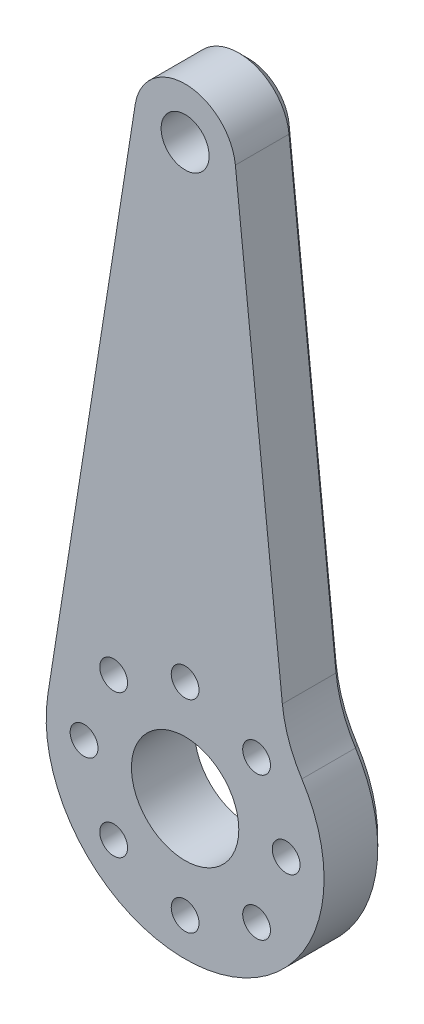
ISO-10303-21;
HEADER;
FILE_DESCRIPTION(('STEP AP214'),'2;1');
FILE_NAME('part.step','',(''),(''),'','','');
FILE_SCHEMA(('AUTOMOTIVE_DESIGN { 1 0 10303 214 1 1 1 1 }'));
ENDSEC;
DATA;
#1=APPLICATION_CONTEXT('core data for automotive mechanical design processes');
#2=APPLICATION_PROTOCOL_DEFINITION('international standard','automotive_design',2000,#1);
#3=PRODUCT_CONTEXT('',#1,'mechanical');
#4=PRODUCT('Part','Part','',(#3));
#5=PRODUCT_RELATED_PRODUCT_CATEGORY('part','',(#4));
#6=PRODUCT_DEFINITION_FORMATION('','',#4);
#7=PRODUCT_DEFINITION_CONTEXT('part definition',#1,'design');
#8=PRODUCT_DEFINITION('design','',#6,#7);
#9=PRODUCT_DEFINITION_SHAPE('','',#8);
#10=(LENGTH_UNIT() NAMED_UNIT(*) SI_UNIT(.MILLI.,.METRE.));
#11=(NAMED_UNIT(*) PLANE_ANGLE_UNIT() SI_UNIT($,.RADIAN.));
#12=(NAMED_UNIT(*) SI_UNIT($,.STERADIAN.) SOLID_ANGLE_UNIT());
#13=UNCERTAINTY_MEASURE_WITH_UNIT(LENGTH_MEASURE(1.E-05),#10,'distance_accuracy_value','');
#14=(GEOMETRIC_REPRESENTATION_CONTEXT(3) GLOBAL_UNCERTAINTY_ASSIGNED_CONTEXT((#13)) GLOBAL_UNIT_ASSIGNED_CONTEXT((#10,
#11,#12)) REPRESENTATION_CONTEXT('',''));
#15=CARTESIAN_POINT('',(0.,0.,0.));
#16=DIRECTION('',(0.,0.,1.));
#17=DIRECTION('',(1.,0.,0.));
#18=AXIS2_PLACEMENT_3D('',#15,#16,#17);
#19=CARTESIAN_POINT('',(-7.02420987567219,-20.1350147129871,5.));
#20=DIRECTION('',(0.,0.,-1.));
#21=DIRECTION('',(-1.,0.,0.));
#22=AXIS2_PLACEMENT_3D('',#19,#20,#21);
#23=CYLINDRICAL_SURFACE('',#22,1.1);
#24=CARTESIAN_POINT('',(-7.02420987567219,-20.1350147129871,5.));
#25=DIRECTION('',(0.,0.,1.));
#26=DIRECTION('',(1.,0.,0.));
#27=AXIS2_PLACEMENT_3D('',#24,#25,#26);
#28=CIRCLE('',#27,1.1);
#29=CARTESIAN_POINT('',(-5.92420987567219,-20.1350147129871,5.));
#30=VERTEX_POINT('',#29);
#31=EDGE_CURVE('E203',#30,#30,#28,.T.);
#32=ORIENTED_EDGE('',*,*,#31,.T.);
#33=EDGE_LOOP('',(#32));
#34=FACE_BOUND('',#33,.T.);
#35=CARTESIAN_POINT('',(-7.02420987567219,-20.1350147129871,2.25));
#36=DIRECTION('',(0.,0.,-1.));
#37=DIRECTION('',(-1.,0.,0.));
#38=AXIS2_PLACEMENT_3D('',#35,#36,#37);
#39=CIRCLE('',#38,1.1);
#40=CARTESIAN_POINT('',(-8.12420987567219,-20.1350147129871,2.25));
#41=VERTEX_POINT('',#40);
#42=EDGE_CURVE('E185',#41,#41,#39,.T.);
#43=ORIENTED_EDGE('',*,*,#42,.T.);
#44=EDGE_LOOP('',(#43));
#45=FACE_BOUND('',#44,.T.);
#46=ADVANCED_FACE('F39',(#34,#45),#23,.F.);
#47=CARTESIAN_POINT('',(-9.36735562617982,-25.7918689624794,5.));
#48=DIRECTION('',(0.,0.,-1.));
#49=DIRECTION('',(-1.,0.,0.));
#50=AXIS2_PLACEMENT_3D('',#47,#48,#49);
#51=CYLINDRICAL_SURFACE('',#50,1.1);
#52=CARTESIAN_POINT('',(-9.36735562617982,-25.7918689624794,5.));
#53=DIRECTION('',(0.,0.,1.));
#54=DIRECTION('',(1.,0.,0.));
#55=AXIS2_PLACEMENT_3D('',#52,#53,#54);
#56=CIRCLE('',#55,1.1);
#57=CARTESIAN_POINT('',(-8.26735562617982,-25.7918689624794,5.));
#58=VERTEX_POINT('',#57);
#59=EDGE_CURVE('E200',#58,#58,#56,.T.);
#60=ORIENTED_EDGE('',*,*,#59,.T.);
#61=EDGE_LOOP('',(#60));
#62=FACE_BOUND('',#61,.T.);
#63=CARTESIAN_POINT('',(-9.36735562617982,-25.7918689624794,2.25));
#64=DIRECTION('',(0.,0.,-1.));
#65=DIRECTION('',(-1.,0.,0.));
#66=AXIS2_PLACEMENT_3D('',#63,#64,#65);
#67=CIRCLE('',#66,1.1);
#68=CARTESIAN_POINT('',(-10.4673556261798,-25.7918689624794,2.25));
#69=VERTEX_POINT('',#68);
#70=EDGE_CURVE('E241',#69,#69,#67,.T.);
#71=ORIENTED_EDGE('',*,*,#70,.T.);
#72=EDGE_LOOP('',(#71));
#73=FACE_BOUND('',#72,.T.);
#74=ADVANCED_FACE('F345',(#62,#73),#51,.F.);
#75=CARTESIAN_POINT('',(-15.0242098756722,-28.1350147129871,5.));
#76=DIRECTION('',(0.,0.,-1.));
#77=DIRECTION('',(-1.,0.,0.));
#78=AXIS2_PLACEMENT_3D('',#75,#76,#77);
#79=CYLINDRICAL_SURFACE('',#78,1.1);
#80=CARTESIAN_POINT('',(-15.0242098756722,-28.1350147129871,5.));
#81=DIRECTION('',(0.,0.,1.));
#82=DIRECTION('',(1.,0.,0.));
#83=AXIS2_PLACEMENT_3D('',#80,#81,#82);
#84=CIRCLE('',#83,1.1);
#85=CARTESIAN_POINT('',(-13.9242098756722,-28.1350147129871,5.));
#86=VERTEX_POINT('',#85);
#87=EDGE_CURVE('E197',#86,#86,#84,.T.);
#88=ORIENTED_EDGE('',*,*,#87,.T.);
#89=EDGE_LOOP('',(#88));
#90=FACE_BOUND('',#89,.T.);
#91=CARTESIAN_POINT('',(-15.0242098756722,-28.1350147129871,2.25));
#92=DIRECTION('',(0.,0.,-1.));
#93=DIRECTION('',(-1.,0.,0.));
#94=AXIS2_PLACEMENT_3D('',#91,#92,#93);
#95=CIRCLE('',#94,1.1);
#96=CARTESIAN_POINT('',(-16.1242098756722,-28.1350147129871,2.25));
#97=VERTEX_POINT('',#96);
#98=EDGE_CURVE('E238',#97,#97,#95,.T.);
#99=ORIENTED_EDGE('',*,*,#98,.T.);
#100=EDGE_LOOP('',(#99));
#101=FACE_BOUND('',#100,.T.);
#102=ADVANCED_FACE('F350',(#90,#101),#79,.F.);
#103=CARTESIAN_POINT('',(-20.6810641251646,-25.7918689624794,5.));
#104=DIRECTION('',(0.,0.,-1.));
#105=DIRECTION('',(-1.,0.,0.));
#106=AXIS2_PLACEMENT_3D('',#103,#104,#105);
#107=CYLINDRICAL_SURFACE('',#106,1.1);
#108=CARTESIAN_POINT('',(-20.6810641251646,-25.7918689624794,5.));
#109=DIRECTION('',(0.,0.,1.));
#110=DIRECTION('',(1.,0.,0.));
#111=AXIS2_PLACEMENT_3D('',#108,#109,#110);
#112=CIRCLE('',#111,1.1);
#113=CARTESIAN_POINT('',(-19.5810641251646,-25.7918689624794,5.));
#114=VERTEX_POINT('',#113);
#115=EDGE_CURVE('E194',#114,#114,#112,.T.);
#116=ORIENTED_EDGE('',*,*,#115,.T.);
#117=EDGE_LOOP('',(#116));
#118=FACE_BOUND('',#117,.T.);
#119=CARTESIAN_POINT('',(-20.6810641251646,-25.7918689624794,2.25));
#120=DIRECTION('',(0.,0.,-1.));
#121=DIRECTION('',(-1.,0.,0.));
#122=AXIS2_PLACEMENT_3D('',#119,#120,#121);
#123=CIRCLE('',#122,1.1);
#124=CARTESIAN_POINT('',(-21.7810641251646,-25.7918689624794,2.25));
#125=VERTEX_POINT('',#124);
#126=EDGE_CURVE('E235',#125,#125,#123,.T.);
#127=ORIENTED_EDGE('',*,*,#126,.T.);
#128=EDGE_LOOP('',(#127));
#129=FACE_BOUND('',#128,.T.);
#130=ADVANCED_FACE('F357',(#118,#129),#107,.F.);
#131=CARTESIAN_POINT('',(-23.0242098756722,-20.1350147129871,5.));
#132=DIRECTION('',(0.,0.,-1.));
#133=DIRECTION('',(-1.,0.,0.));
#134=AXIS2_PLACEMENT_3D('',#131,#132,#133);
#135=CYLINDRICAL_SURFACE('',#134,1.1);
#136=CARTESIAN_POINT('',(-23.0242098756722,-20.1350147129871,5.));
#137=DIRECTION('',(0.,0.,1.));
#138=DIRECTION('',(1.,0.,0.));
#139=AXIS2_PLACEMENT_3D('',#136,#137,#138);
#140=CIRCLE('',#139,1.1);
#141=CARTESIAN_POINT('',(-21.9242098756722,-20.1350147129871,5.));
#142=VERTEX_POINT('',#141);
#143=EDGE_CURVE('E191',#142,#142,#140,.T.);
#144=ORIENTED_EDGE('',*,*,#143,.T.);
#145=EDGE_LOOP('',(#144));
#146=FACE_BOUND('',#145,.T.);
#147=CARTESIAN_POINT('',(-23.0242098756722,-20.1350147129871,2.25));
#148=DIRECTION('',(0.,0.,-1.));
#149=DIRECTION('',(-1.,0.,0.));
#150=AXIS2_PLACEMENT_3D('',#147,#148,#149);
#151=CIRCLE('',#150,1.1);
#152=CARTESIAN_POINT('',(-24.1242098756722,-20.1350147129871,2.25));
#153=VERTEX_POINT('',#152);
#154=EDGE_CURVE('E232',#153,#153,#151,.T.);
#155=ORIENTED_EDGE('',*,*,#154,.T.);
#156=EDGE_LOOP('',(#155));
#157=FACE_BOUND('',#156,.T.);
#158=ADVANCED_FACE('F361',(#146,#157),#135,.F.);
#159=CARTESIAN_POINT('',(-20.6810641251646,-14.4781604634947,5.));
#160=DIRECTION('',(0.,0.,-1.));
#161=DIRECTION('',(-1.,0.,0.));
#162=AXIS2_PLACEMENT_3D('',#159,#160,#161);
#163=CYLINDRICAL_SURFACE('',#162,1.1);
#164=CARTESIAN_POINT('',(-20.6810641251646,-14.4781604634947,5.));
#165=DIRECTION('',(0.,0.,1.));
#166=DIRECTION('',(1.,0.,0.));
#167=AXIS2_PLACEMENT_3D('',#164,#165,#166);
#168=CIRCLE('',#167,1.1);
#169=CARTESIAN_POINT('',(-19.5810641251646,-14.4781604634947,5.));
#170=VERTEX_POINT('',#169);
#171=EDGE_CURVE('E188',#170,#170,#168,.T.);
#172=ORIENTED_EDGE('',*,*,#171,.T.);
#173=EDGE_LOOP('',(#172));
#174=FACE_BOUND('',#173,.T.);
#175=CARTESIAN_POINT('',(-20.6810641251646,-14.4781604634947,2.25));
#176=DIRECTION('',(0.,0.,-1.));
#177=DIRECTION('',(-1.,0.,0.));
#178=AXIS2_PLACEMENT_3D('',#175,#176,#177);
#179=CIRCLE('',#178,1.1);
#180=CARTESIAN_POINT('',(-21.7810641251646,-14.4781604634947,2.25));
#181=VERTEX_POINT('',#180);
#182=EDGE_CURVE('E229',#181,#181,#179,.T.);
#183=ORIENTED_EDGE('',*,*,#182,.T.);
#184=EDGE_LOOP('',(#183));
#185=FACE_BOUND('',#184,.T.);
#186=ADVANCED_FACE('F365',(#174,#185),#163,.F.);
#187=CARTESIAN_POINT('',(-15.0242098756722,-12.1350147129871,5.));
#188=DIRECTION('',(0.,0.,-1.));
#189=DIRECTION('',(-1.,0.,0.));
#190=AXIS2_PLACEMENT_3D('',#187,#188,#189);
#191=CYLINDRICAL_SURFACE('',#190,1.1);
#192=CARTESIAN_POINT('',(-15.0242098756722,-12.1350147129871,5.));
#193=DIRECTION('',(0.,0.,1.));
#194=DIRECTION('',(1.,0.,0.));
#195=AXIS2_PLACEMENT_3D('',#192,#193,#194);
#196=CIRCLE('',#195,1.1);
#197=CARTESIAN_POINT('',(-13.9242098756722,-12.1350147129871,5.));
#198=VERTEX_POINT('',#197);
#199=EDGE_CURVE('E184',#198,#198,#196,.T.);
#200=ORIENTED_EDGE('',*,*,#199,.T.);
#201=EDGE_LOOP('',(#200));
#202=FACE_BOUND('',#201,.T.);
#203=CARTESIAN_POINT('',(-15.0242098756722,-12.1350147129871,2.25));
#204=DIRECTION('',(0.,0.,-1.));
#205=DIRECTION('',(-1.,0.,0.));
#206=AXIS2_PLACEMENT_3D('',#203,#204,#205);
#207=CIRCLE('',#206,1.1);
#208=CARTESIAN_POINT('',(-16.1242098756722,-12.1350147129871,2.25));
#209=VERTEX_POINT('',#208);
#210=EDGE_CURVE('E226',#209,#209,#207,.T.);
#211=ORIENTED_EDGE('',*,*,#210,.T.);
#212=EDGE_LOOP('',(#211));
#213=FACE_BOUND('',#212,.T.);
#214=ADVANCED_FACE('F369',(#202,#213),#191,.F.);
#215=CARTESIAN_POINT('',(-9.36735562617982,-14.4781604634947,5.));
#216=DIRECTION('',(0.,0.,-1.));
#217=DIRECTION('',(-1.,0.,0.));
#218=AXIS2_PLACEMENT_3D('',#215,#216,#217);
#219=CYLINDRICAL_SURFACE('',#218,1.1);
#220=CARTESIAN_POINT('',(-9.36735562617982,-14.4781604634947,5.));
#221=DIRECTION('',(0.,0.,1.));
#222=DIRECTION('',(1.,0.,0.));
#223=AXIS2_PLACEMENT_3D('',#220,#221,#222);
#224=CIRCLE('',#223,1.1);
#225=CARTESIAN_POINT('',(-8.26735562617982,-14.4781604634947,5.));
#226=VERTEX_POINT('',#225);
#227=EDGE_CURVE('E181',#226,#226,#224,.T.);
#228=ORIENTED_EDGE('',*,*,#227,.T.);
#229=EDGE_LOOP('',(#228));
#230=FACE_BOUND('',#229,.T.);
#231=CARTESIAN_POINT('',(-9.36735562617982,-14.4781604634947,2.25));
#232=DIRECTION('',(0.,0.,-1.));
#233=DIRECTION('',(-1.,0.,0.));
#234=AXIS2_PLACEMENT_3D('',#231,#232,#233);
#235=CIRCLE('',#234,1.1);
#236=CARTESIAN_POINT('',(-10.4673556261798,-14.4781604634947,2.25));
#237=VERTEX_POINT('',#236);
#238=EDGE_CURVE('E178',#237,#237,#235,.T.);
#239=ORIENTED_EDGE('',*,*,#238,.T.);
#240=EDGE_LOOP('',(#239));
#241=FACE_BOUND('',#240,.T.);
#242=ADVANCED_FACE('F373',(#230,#241),#219,.F.);
#243=CARTESIAN_POINT('',(-15.0242098756722,24.8649852870129,5.));
#244=DIRECTION('',(0.,0.,1.));
#245=DIRECTION('',(1.,0.,0.));
#246=AXIS2_PLACEMENT_3D('',#243,#244,#245);
#247=PLANE('',#246);
#248=DIRECTION('',(0.105413349957939,-0.994428491974483,0.));
#249=VECTOR('',#248,1.);
#250=CARTESIAN_POINT('',(-11.0464959077743,25.2866386868447,5.));
#251=LINE('',#250,#249);
#252=CARTESIAN_POINT('',(-11.0464959077743,25.2866386868447,5.));
#253=VERTEX_POINT('',#252);
#254=CARTESIAN_POINT('',(-7.32756928596649,-9.79626678730718,5.));
#255=VERTEX_POINT('',#254);
#256=EDGE_CURVE('E118',#253,#255,#251,.T.);
#257=ORIENTED_EDGE('',*,*,#256,.F.);
#258=CARTESIAN_POINT('',(-15.0242098756722,24.8649852870129,5.));
#259=DIRECTION('',(0.,0.,1.));
#260=DIRECTION('',(1.,0.,0.));
#261=AXIS2_PLACEMENT_3D('',#258,#259,#260);
#262=CIRCLE('',#261,4.);
#263=CARTESIAN_POINT('',(-18.9755184571643,25.4872075092352,5.));
#264=VERTEX_POINT('',#263);
#265=EDGE_CURVE('E103',#253,#264,#262,.T.);
#266=ORIENTED_EDGE('',*,*,#265,.T.);
#267=DIRECTION('',(-0.155555555555555,-0.987827145373016,0.));
#268=VECTOR('',#267,1.);
#269=CARTESIAN_POINT('',(-18.9755184571643,25.4872075092352,5.));
#270=LINE('',#269,#268);
#271=CARTESIAN_POINT('',(-25.8903084747754,-18.4239036018759,5.));
#272=VERTEX_POINT('',#271);
#273=EDGE_CURVE('E110',#264,#272,#270,.T.);
#274=ORIENTED_EDGE('',*,*,#273,.T.);
#275=CARTESIAN_POINT('',(-15.0242098756722,-20.1350147129871,5.));
#276=DIRECTION('',(0.,0.,1.));
#277=DIRECTION('',(1.,0.,0.));
#278=AXIS2_PLACEMENT_3D('',#275,#276,#277);
#279=CIRCLE('',#278,11.);
#280=CARTESIAN_POINT('',(-5.78372508500763,-14.1673149188036,5.));
#281=VERTEX_POINT('',#280);
#282=EDGE_CURVE('E218',#272,#281,#279,.T.);
#283=ORIENTED_EDGE('',*,*,#282,.T.);
#284=CARTESIAN_POINT('',(2.61671563377834,-8.7421332877278,5.));
#285=DIRECTION('',(0.,0.,1.));
#286=DIRECTION('',(1.,0.,0.));
#287=AXIS2_PLACEMENT_3D('',#284,#285,#286);
#288=CIRCLE('',#287,10.);
#289=EDGE_CURVE('E127',#281,#255,#288,.F.);
#290=ORIENTED_EDGE('',*,*,#289,.T.);
#291=EDGE_LOOP('',(#257,#266,#274,#283,#290));
#292=FACE_BOUND('',#291,.T.);
#293=ORIENTED_EDGE('',*,*,#199,.F.);
#294=EDGE_LOOP('',(#293));
#295=FACE_BOUND('',#294,.T.);
#296=ORIENTED_EDGE('',*,*,#143,.F.);
#297=EDGE_LOOP('',(#296));
#298=FACE_BOUND('',#297,.T.);
#299=ORIENTED_EDGE('',*,*,#87,.F.);
#300=EDGE_LOOP('',(#299));
#301=FACE_BOUND('',#300,.T.);
#302=ORIENTED_EDGE('',*,*,#31,.F.);
#303=EDGE_LOOP('',(#302));
#304=FACE_BOUND('',#303,.T.);
#305=CARTESIAN_POINT('',(-15.0242098756722,24.8649852870129,5.));
#306=DIRECTION('',(0.,0.,1.));
#307=DIRECTION('',(1.,0.,0.));
#308=AXIS2_PLACEMENT_3D('',#305,#306,#307);
#309=CIRCLE('',#308,1.9);
#310=CARTESIAN_POINT('',(-13.1242098756722,24.8649852870129,5.));
#311=VERTEX_POINT('',#310);
#312=EDGE_CURVE('E111',#311,#311,#309,.T.);
#313=ORIENTED_EDGE('',*,*,#312,.F.);
#314=EDGE_LOOP('',(#313));
#315=FACE_BOUND('',#314,.T.);
#316=CARTESIAN_POINT('',(-15.0242098756722,-20.1350147129871,5.));
#317=DIRECTION('',(0.,0.,1.));
#318=DIRECTION('',(1.,0.,0.));
#319=AXIS2_PLACEMENT_3D('',#316,#317,#318);
#320=CIRCLE('',#319,4.25);
#321=CARTESIAN_POINT('',(-10.7742098756722,-20.1350147129871,5.));
#322=VERTEX_POINT('',#321);
#323=EDGE_CURVE('E207',#322,#322,#320,.T.);
#324=ORIENTED_EDGE('',*,*,#323,.F.);
#325=EDGE_LOOP('',(#324));
#326=FACE_BOUND('',#325,.T.);
#327=ORIENTED_EDGE('',*,*,#59,.F.);
#328=EDGE_LOOP('',(#327));
#329=FACE_BOUND('',#328,.T.);
#330=ORIENTED_EDGE('',*,*,#115,.F.);
#331=EDGE_LOOP('',(#330));
#332=FACE_BOUND('',#331,.T.);
#333=ORIENTED_EDGE('',*,*,#171,.F.);
#334=EDGE_LOOP('',(#333));
#335=FACE_BOUND('',#334,.T.);
#336=ORIENTED_EDGE('',*,*,#227,.F.);
#337=EDGE_LOOP('',(#336));
#338=FACE_BOUND('',#337,.T.);
#339=ADVANCED_FACE('F123',(#292,#295,#298,#301,#304,#315,#326,#329,#332,#335,#338),#247,.T.);
#340=CARTESIAN_POINT('',(-15.0242098756722,24.8649852870129,0.));
#341=DIRECTION('',(0.,0.,1.));
#342=DIRECTION('',(1.,0.,0.));
#343=AXIS2_PLACEMENT_3D('',#340,#341,#342);
#344=PLANE('',#343);
#345=CARTESIAN_POINT('',(-15.0242098756722,24.8649852870129,0.));
#346=DIRECTION('',(0.,0.,1.));
#347=DIRECTION('',(1.,0.,0.));
#348=AXIS2_PLACEMENT_3D('',#345,#346,#347);
#349=CIRCLE('',#348,3.25);
#350=CARTESIAN_POINT('',(-18.2346480981345,25.3705408425685,0.));
#351=VERTEX_POINT('',#350);
#352=CARTESIAN_POINT('',(-11.7923172767551,25.2075786743763,0.));
#353=VERTEX_POINT('',#352);
#354=EDGE_CURVE('E256',#351,#353,#349,.F.);
#355=ORIENTED_EDGE('',*,*,#354,.T.);
#356=DIRECTION('',(0.105413349957939,-0.994428491974483,0.));
#357=VECTOR('',#356,1.);
#358=CARTESIAN_POINT('',(-11.7923172767551,25.2075786743762,0.));
#359=LINE('',#358,#357);
#360=CARTESIAN_POINT('',(-8.07339065494735,-9.87532679977564,0.));
#361=VERTEX_POINT('',#360);
#362=EDGE_CURVE('E260',#353,#361,#359,.T.);
#363=ORIENTED_EDGE('',*,*,#362,.T.);
#364=CARTESIAN_POINT('',(2.61671563377834,-8.7421332877278,0.));
#365=DIRECTION('',(0.,0.,1.));
#366=DIRECTION('',(1.,0.,0.));
#367=AXIS2_PLACEMENT_3D('',#364,#365,#366);
#368=CIRCLE('',#367,10.75);
#369=CARTESIAN_POINT('',(-6.41375813891658,-14.5742035411343,0.));
#370=VERTEX_POINT('',#369);
#371=EDGE_CURVE('E258',#361,#370,#368,.T.);
#372=ORIENTED_EDGE('',*,*,#371,.T.);
#373=CARTESIAN_POINT('',(-15.0242098756722,-20.1350147129871,0.));
#374=DIRECTION('',(0.,0.,1.));
#375=DIRECTION('',(1.,0.,0.));
#376=AXIS2_PLACEMENT_3D('',#373,#374,#375);
#377=CIRCLE('',#376,10.25);
#378=CARTESIAN_POINT('',(-25.1494381157456,-18.5405702685426,0.));
#379=VERTEX_POINT('',#378);
#380=EDGE_CURVE('E254',#370,#379,#377,.F.);
#381=ORIENTED_EDGE('',*,*,#380,.T.);
#382=DIRECTION('',(0.155555555555555,0.987827145373016,0.));
#383=VECTOR('',#382,1.);
#384=CARTESIAN_POINT('',(-18.2346480981345,25.3705408425685,0.));
#385=LINE('',#384,#383);
#386=EDGE_CURVE('E251',#379,#351,#385,.T.);
#387=ORIENTED_EDGE('',*,*,#386,.T.);
#388=EDGE_LOOP('',(#355,#363,#372,#381,#387));
#389=FACE_BOUND('',#388,.T.);
#390=CARTESIAN_POINT('',(-20.6810641251646,-14.4781604634947,0.));
#391=DIRECTION('',(0.,0.,-1.));
#392=DIRECTION('',(-1.,0.,0.));
#393=AXIS2_PLACEMENT_3D('',#390,#391,#392);
#394=CIRCLE('',#393,1.75);
#395=CARTESIAN_POINT('',(-22.4310641251646,-14.4781604634947,0.));
#396=VERTEX_POINT('',#395);
#397=EDGE_CURVE('E128',#396,#396,#394,.T.);
#398=ORIENTED_EDGE('',*,*,#397,.F.);
#399=EDGE_LOOP('',(#398));
#400=FACE_BOUND('',#399,.T.);
#401=CARTESIAN_POINT('',(-15.0242098756722,-12.1350147129871,0.));
#402=DIRECTION('',(0.,0.,-1.));
#403=DIRECTION('',(-1.,0.,0.));
#404=AXIS2_PLACEMENT_3D('',#401,#402,#403);
#405=CIRCLE('',#404,1.75);
#406=CARTESIAN_POINT('',(-16.7742098756722,-12.1350147129871,0.));
#407=VERTEX_POINT('',#406);
#408=EDGE_CURVE('E169',#407,#407,#405,.T.);
#409=ORIENTED_EDGE('',*,*,#408,.F.);
#410=EDGE_LOOP('',(#409));
#411=FACE_BOUND('',#410,.T.);
#412=CARTESIAN_POINT('',(-9.36735562617982,-14.4781604634947,0.));
#413=DIRECTION('',(0.,0.,-1.));
#414=DIRECTION('',(-1.,0.,0.));
#415=AXIS2_PLACEMENT_3D('',#412,#413,#414);
#416=CIRCLE('',#415,1.75);
#417=CARTESIAN_POINT('',(-11.1173556261798,-14.4781604634947,0.));
#418=VERTEX_POINT('',#417);
#419=EDGE_CURVE('E162',#418,#418,#416,.T.);
#420=ORIENTED_EDGE('',*,*,#419,.F.);
#421=EDGE_LOOP('',(#420));
#422=FACE_BOUND('',#421,.T.);
#423=CARTESIAN_POINT('',(-7.02420987567219,-20.1350147129871,0.));
#424=DIRECTION('',(0.,0.,-1.));
#425=DIRECTION('',(-1.,0.,0.));
#426=AXIS2_PLACEMENT_3D('',#423,#424,#425);
#427=CIRCLE('',#426,1.75);
#428=CARTESIAN_POINT('',(-8.7742098756722,-20.1350147129871,0.));
#429=VERTEX_POINT('',#428);
#430=EDGE_CURVE('E156',#429,#429,#427,.T.);
#431=ORIENTED_EDGE('',*,*,#430,.F.);
#432=EDGE_LOOP('',(#431));
#433=FACE_BOUND('',#432,.T.);
#434=CARTESIAN_POINT('',(-9.36735562617981,-25.7918689624794,0.));
#435=DIRECTION('',(0.,0.,-1.));
#436=DIRECTION('',(-1.,0.,0.));
#437=AXIS2_PLACEMENT_3D('',#434,#435,#436);
#438=CIRCLE('',#437,1.75);
#439=CARTESIAN_POINT('',(-11.1173556261798,-25.7918689624794,0.));
#440=VERTEX_POINT('',#439);
#441=EDGE_CURVE('E150',#440,#440,#438,.T.);
#442=ORIENTED_EDGE('',*,*,#441,.F.);
#443=EDGE_LOOP('',(#442));
#444=FACE_BOUND('',#443,.T.);
#445=CARTESIAN_POINT('',(-15.0242098756722,-28.135014712987,0.));
#446=DIRECTION('',(0.,0.,-1.));
#447=DIRECTION('',(-1.,0.,0.));
#448=AXIS2_PLACEMENT_3D('',#445,#446,#447);
#449=CIRCLE('',#448,1.75);
#450=CARTESIAN_POINT('',(-16.7742098756722,-28.135014712987,0.));
#451=VERTEX_POINT('',#450);
#452=EDGE_CURVE('E144',#451,#451,#449,.T.);
#453=ORIENTED_EDGE('',*,*,#452,.F.);
#454=EDGE_LOOP('',(#453));
#455=FACE_BOUND('',#454,.T.);
#456=CARTESIAN_POINT('',(-20.6810641251646,-25.7918689624794,0.));
#457=DIRECTION('',(0.,0.,-1.));
#458=DIRECTION('',(-1.,0.,0.));
#459=AXIS2_PLACEMENT_3D('',#456,#457,#458);
#460=CIRCLE('',#459,1.74999999999999);
#461=CARTESIAN_POINT('',(-22.4310641251646,-25.7918689624794,0.));
#462=VERTEX_POINT('',#461);
#463=EDGE_CURVE('E138',#462,#462,#460,.T.);
#464=ORIENTED_EDGE('',*,*,#463,.F.);
#465=EDGE_LOOP('',(#464));
#466=FACE_BOUND('',#465,.T.);
#467=CARTESIAN_POINT('',(-23.0242098756722,-20.1350147129871,0.));
#468=DIRECTION('',(0.,0.,-1.));
#469=DIRECTION('',(-1.,0.,0.));
#470=AXIS2_PLACEMENT_3D('',#467,#468,#469);
#471=CIRCLE('',#470,1.75);
#472=CARTESIAN_POINT('',(-24.7742098756722,-20.1350147129871,0.));
#473=VERTEX_POINT('',#472);
#474=EDGE_CURVE('E137',#473,#473,#471,.T.);
#475=ORIENTED_EDGE('',*,*,#474,.F.);
#476=EDGE_LOOP('',(#475));
#477=FACE_BOUND('',#476,.T.);
#478=CARTESIAN_POINT('',(-15.0242098756722,24.8649852870129,0.));
#479=DIRECTION('',(0.,0.,1.));
#480=DIRECTION('',(1.,0.,0.));
#481=AXIS2_PLACEMENT_3D('',#478,#479,#480);
#482=CIRCLE('',#481,1.9);
#483=CARTESIAN_POINT('',(-13.1242098756722,24.8649852870129,0.));
#484=VERTEX_POINT('',#483);
#485=EDGE_CURVE('E210',#484,#484,#482,.T.);
#486=ORIENTED_EDGE('',*,*,#485,.T.);
#487=EDGE_LOOP('',(#486));
#488=FACE_BOUND('',#487,.T.);
#489=CARTESIAN_POINT('',(-15.0242098756722,-20.1350147129871,0.));
#490=DIRECTION('',(0.,0.,1.));
#491=DIRECTION('',(1.,0.,0.));
#492=AXIS2_PLACEMENT_3D('',#489,#490,#491);
#493=CIRCLE('',#492,4.25);
#494=CARTESIAN_POINT('',(-10.7742098756722,-20.1350147129871,0.));
#495=VERTEX_POINT('',#494);
#496=EDGE_CURVE('E206',#495,#495,#493,.T.);
#497=ORIENTED_EDGE('',*,*,#496,.T.);
#498=EDGE_LOOP('',(#497));
#499=FACE_BOUND('',#498,.T.);
#500=ADVANCED_FACE('F304',(#389,#400,#411,#422,#433,#444,#455,#466,#477,#488,#499),#344,.F.);
#501=CARTESIAN_POINT('',(-15.0242098756722,24.8649852870129,5.));
#502=DIRECTION('',(0.,0.,-1.));
#503=DIRECTION('',(-1.,0.,0.));
#504=AXIS2_PLACEMENT_3D('',#501,#502,#503);
#505=CYLINDRICAL_SURFACE('',#504,4.);
#506=DIRECTION('',(0.,0.,-1.));
#507=VECTOR('',#506,1.);
#508=CARTESIAN_POINT('',(-11.0464959077743,25.2866386868447,10.));
#509=LINE('',#508,#507);
#510=CARTESIAN_POINT('',(-11.0464959077743,25.2866386868447,0.749999999999994));
#511=VERTEX_POINT('',#510);
#512=EDGE_CURVE('E106',#253,#511,#509,.T.);
#513=ORIENTED_EDGE('',*,*,#512,.T.);
#514=CARTESIAN_POINT('',(-15.0242098756722,24.8649852870129,0.749999999999994));
#515=DIRECTION('',(0.,0.,1.));
#516=DIRECTION('',(1.,0.,0.));
#517=AXIS2_PLACEMENT_3D('',#514,#515,#516);
#518=CIRCLE('',#517,4.);
#519=CARTESIAN_POINT('',(-18.9755184571643,25.4872075092352,0.749999999999994));
#520=VERTEX_POINT('',#519);
#521=EDGE_CURVE('E63',#511,#520,#518,.T.);
#522=ORIENTED_EDGE('',*,*,#521,.T.);
#523=DIRECTION('',(0.,0.,-1.));
#524=VECTOR('',#523,1.);
#525=CARTESIAN_POINT('',(-18.9755184571643,25.4872075092352,5.));
#526=LINE('',#525,#524);
#527=EDGE_CURVE('E107',#264,#520,#526,.T.);
#528=ORIENTED_EDGE('',*,*,#527,.F.);
#529=ORIENTED_EDGE('',*,*,#265,.F.);
#530=EDGE_LOOP('',(#513,#522,#528,#529));
#531=FACE_BOUND('',#530,.T.);
#532=ADVANCED_FACE('F105',(#531),#505,.T.);
#533=CARTESIAN_POINT('',(-18.9755184571643,25.4872075092352,5.));
#534=DIRECTION('',(0.987827145373016,-0.155555555555555,0.));
#535=DIRECTION('',(0.155555555555555,0.987827145373016,0.));
#536=AXIS2_PLACEMENT_3D('',#533,#534,#535);
#537=PLANE('',#536);
#538=ORIENTED_EDGE('',*,*,#527,.T.);
#539=DIRECTION('',(-0.155555555555555,-0.987827145373016,0.));
#540=VECTOR('',#539,1.);
#541=CARTESIAN_POINT('',(-18.9755184571643,25.4872075092352,0.749999999999994));
#542=LINE('',#541,#540);
#543=CARTESIAN_POINT('',(-25.8903084747754,-18.4239036018759,0.749999999999994));
#544=VERTEX_POINT('',#543);
#545=EDGE_CURVE('E11',#520,#544,#542,.T.);
#546=ORIENTED_EDGE('',*,*,#545,.T.);
#547=DIRECTION('',(0.,0.,-1.));
#548=VECTOR('',#547,1.);
#549=CARTESIAN_POINT('',(-25.8903084747754,-18.4239036018759,5.));
#550=LINE('',#549,#548);
#551=EDGE_CURVE('E220',#272,#544,#550,.T.);
#552=ORIENTED_EDGE('',*,*,#551,.F.);
#553=ORIENTED_EDGE('',*,*,#273,.F.);
#554=EDGE_LOOP('',(#538,#546,#552,#553));
#555=FACE_BOUND('',#554,.T.);
#556=ADVANCED_FACE('F499',(#555),#537,.F.);
#557=CARTESIAN_POINT('',(-15.0242098756722,-20.1350147129871,5.));
#558=DIRECTION('',(0.,0.,-1.));
#559=DIRECTION('',(-1.,0.,0.));
#560=AXIS2_PLACEMENT_3D('',#557,#558,#559);
#561=CYLINDRICAL_SURFACE('',#560,11.);
#562=ORIENTED_EDGE('',*,*,#551,.T.);
#563=CARTESIAN_POINT('',(-15.0242098756722,-20.1350147129871,0.749999999999994));
#564=DIRECTION('',(0.,0.,1.));
#565=DIRECTION('',(1.,0.,0.));
#566=AXIS2_PLACEMENT_3D('',#563,#564,#565);
#567=CIRCLE('',#566,11.);
#568=CARTESIAN_POINT('',(-5.78372508500763,-14.1673149188036,0.749999999999994));
#569=VERTEX_POINT('',#568);
#570=EDGE_CURVE('E49',#544,#569,#567,.T.);
#571=ORIENTED_EDGE('',*,*,#570,.T.);
#572=DIRECTION('',(0.,0.,-1.));
#573=VECTOR('',#572,1.);
#574=CARTESIAN_POINT('',(-5.78372508500763,-14.1673149188036,5.));
#575=LINE('',#574,#573);
#576=EDGE_CURVE('E247',#569,#281,#575,.F.);
#577=ORIENTED_EDGE('',*,*,#576,.T.);
#578=ORIENTED_EDGE('',*,*,#282,.F.);
#579=EDGE_LOOP('',(#562,#571,#577,#578));
#580=FACE_BOUND('',#579,.T.);
#581=ADVANCED_FACE('F290',(#580),#561,.T.);
#582=CARTESIAN_POINT('',(-15.0242098756722,24.8649852870129,5.));
#583=DIRECTION('',(0.,0.,-1.));
#584=DIRECTION('',(-1.,0.,0.));
#585=AXIS2_PLACEMENT_3D('',#582,#583,#584);
#586=CYLINDRICAL_SURFACE('',#585,1.9);
#587=ORIENTED_EDGE('',*,*,#312,.T.);
#588=EDGE_LOOP('',(#587));
#589=FACE_BOUND('',#588,.T.);
#590=ORIENTED_EDGE('',*,*,#485,.F.);
#591=EDGE_LOOP('',(#590));
#592=FACE_BOUND('',#591,.T.);
#593=ADVANCED_FACE('F331',(#589,#592),#586,.F.);
#594=CARTESIAN_POINT('',(-15.0242098756722,-20.1350147129871,5.));
#595=DIRECTION('',(0.,0.,-1.));
#596=DIRECTION('',(-1.,0.,0.));
#597=AXIS2_PLACEMENT_3D('',#594,#595,#596);
#598=CYLINDRICAL_SURFACE('',#597,4.25);
#599=ORIENTED_EDGE('',*,*,#323,.T.);
#600=EDGE_LOOP('',(#599));
#601=FACE_BOUND('',#600,.T.);
#602=ORIENTED_EDGE('',*,*,#496,.F.);
#603=EDGE_LOOP('',(#602));
#604=FACE_BOUND('',#603,.T.);
#605=ADVANCED_FACE('F328',(#601,#604),#598,.F.);
#606=CARTESIAN_POINT('',(-9.36735562617982,-14.4781604634947,2.25));
#607=DIRECTION('',(0.,0.,-1.));
#608=DIRECTION('',(-1.,0.,0.));
#609=AXIS2_PLACEMENT_3D('',#606,#607,#608);
#610=CYLINDRICAL_SURFACE('',#609,1.75);
#611=CARTESIAN_POINT('',(-9.36735562617982,-14.4781604634947,2.25));
#612=DIRECTION('',(0.,0.,-1.));
#613=DIRECTION('',(-1.,0.,0.));
#614=AXIS2_PLACEMENT_3D('',#611,#612,#613);
#615=CIRCLE('',#614,1.75);
#616=CARTESIAN_POINT('',(-11.1173556261798,-14.4781604634947,2.25));
#617=VERTEX_POINT('',#616);
#618=EDGE_CURVE('E159',#617,#617,#615,.T.);
#619=ORIENTED_EDGE('',*,*,#618,.F.);
#620=EDGE_LOOP('',(#619));
#621=FACE_BOUND('',#620,.T.);
#622=ORIENTED_EDGE('',*,*,#419,.T.);
#623=EDGE_LOOP('',(#622));
#624=FACE_BOUND('',#623,.T.);
#625=ADVANCED_FACE('F330',(#621,#624),#610,.F.);
#626=CARTESIAN_POINT('',(-9.36735562617982,-14.4781604634947,2.25));
#627=DIRECTION('',(0.,0.,-1.));
#628=DIRECTION('',(-1.,0.,0.));
#629=AXIS2_PLACEMENT_3D('',#626,#627,#628);
#630=PLANE('',#629);
#631=ORIENTED_EDGE('',*,*,#238,.F.);
#632=EDGE_LOOP('',(#631));
#633=FACE_BOUND('',#632,.T.);
#634=ORIENTED_EDGE('',*,*,#618,.T.);
#635=EDGE_LOOP('',(#634));
#636=FACE_BOUND('',#635,.T.);
#637=ADVANCED_FACE('F338',(#633,#636),#630,.T.);
#638=CARTESIAN_POINT('',(-15.0242098756722,-12.1350147129871,2.25));
#639=DIRECTION('',(0.,0.,-1.));
#640=DIRECTION('',(-1.,0.,0.));
#641=AXIS2_PLACEMENT_3D('',#638,#639,#640);
#642=CYLINDRICAL_SURFACE('',#641,1.75);
#643=CARTESIAN_POINT('',(-15.0242098756722,-12.1350147129871,2.25));
#644=DIRECTION('',(0.,0.,-1.));
#645=DIRECTION('',(-1.,0.,0.));
#646=AXIS2_PLACEMENT_3D('',#643,#644,#645);
#647=CIRCLE('',#646,1.75);
#648=CARTESIAN_POINT('',(-16.7742098756722,-12.1350147129871,2.25));
#649=VERTEX_POINT('',#648);
#650=EDGE_CURVE('E165',#649,#649,#647,.T.);
#651=ORIENTED_EDGE('',*,*,#650,.F.);
#652=EDGE_LOOP('',(#651));
#653=FACE_BOUND('',#652,.T.);
#654=ORIENTED_EDGE('',*,*,#408,.T.);
#655=EDGE_LOOP('',(#654));
#656=FACE_BOUND('',#655,.T.);
#657=ADVANCED_FACE('F396',(#653,#656),#642,.F.);
#658=CARTESIAN_POINT('',(-15.0242098756722,-12.1350147129871,2.25));
#659=DIRECTION('',(0.,0.,-1.));
#660=DIRECTION('',(-1.,0.,0.));
#661=AXIS2_PLACEMENT_3D('',#658,#659,#660);
#662=PLANE('',#661);
#663=ORIENTED_EDGE('',*,*,#210,.F.);
#664=EDGE_LOOP('',(#663));
#665=FACE_BOUND('',#664,.T.);
#666=ORIENTED_EDGE('',*,*,#650,.T.);
#667=EDGE_LOOP('',(#666));
#668=FACE_BOUND('',#667,.T.);
#669=ADVANCED_FACE('F391',(#665,#668),#662,.T.);
#670=CARTESIAN_POINT('',(-20.6810641251646,-14.4781604634947,2.25));
#671=DIRECTION('',(0.,0.,-1.));
#672=DIRECTION('',(-1.,0.,0.));
#673=AXIS2_PLACEMENT_3D('',#670,#671,#672);
#674=CYLINDRICAL_SURFACE('',#673,1.75);
#675=CARTESIAN_POINT('',(-20.6810641251646,-14.4781604634947,2.25));
#676=DIRECTION('',(0.,0.,-1.));
#677=DIRECTION('',(-1.,0.,0.));
#678=AXIS2_PLACEMENT_3D('',#675,#676,#677);
#679=CIRCLE('',#678,1.75);
#680=CARTESIAN_POINT('',(-22.4310641251646,-14.4781604634947,2.25));
#681=VERTEX_POINT('',#680);
#682=EDGE_CURVE('E131',#681,#681,#679,.T.);
#683=ORIENTED_EDGE('',*,*,#682,.F.);
#684=EDGE_LOOP('',(#683));
#685=FACE_BOUND('',#684,.T.);
#686=ORIENTED_EDGE('',*,*,#397,.T.);
#687=EDGE_LOOP('',(#686));
#688=FACE_BOUND('',#687,.T.);
#689=ADVANCED_FACE('F388',(#685,#688),#674,.F.);
#690=CARTESIAN_POINT('',(-20.6810641251646,-14.4781604634947,2.25));
#691=DIRECTION('',(0.,0.,-1.));
#692=DIRECTION('',(-1.,0.,0.));
#693=AXIS2_PLACEMENT_3D('',#690,#691,#692);
#694=PLANE('',#693);
#695=ORIENTED_EDGE('',*,*,#182,.F.);
#696=EDGE_LOOP('',(#695));
#697=FACE_BOUND('',#696,.T.);
#698=ORIENTED_EDGE('',*,*,#682,.T.);
#699=EDGE_LOOP('',(#698));
#700=FACE_BOUND('',#699,.T.);
#701=ADVANCED_FACE('F382',(#697,#700),#694,.T.);
#702=CARTESIAN_POINT('',(-23.0242098756722,-20.1350147129871,2.25));
#703=DIRECTION('',(0.,0.,-1.));
#704=DIRECTION('',(-1.,0.,0.));
#705=AXIS2_PLACEMENT_3D('',#702,#703,#704);
#706=CYLINDRICAL_SURFACE('',#705,1.75);
#707=CARTESIAN_POINT('',(-23.0242098756722,-20.1350147129871,2.25));
#708=DIRECTION('',(0.,0.,-1.));
#709=DIRECTION('',(-1.,0.,0.));
#710=AXIS2_PLACEMENT_3D('',#707,#708,#709);
#711=CIRCLE('',#710,1.75);
#712=CARTESIAN_POINT('',(-24.7742098756722,-20.1350147129871,2.25));
#713=VERTEX_POINT('',#712);
#714=EDGE_CURVE('E175',#713,#713,#711,.T.);
#715=ORIENTED_EDGE('',*,*,#714,.F.);
#716=EDGE_LOOP('',(#715));
#717=FACE_BOUND('',#716,.T.);
#718=ORIENTED_EDGE('',*,*,#474,.T.);
#719=EDGE_LOOP('',(#718));
#720=FACE_BOUND('',#719,.T.);
#721=ADVANCED_FACE('F378',(#717,#720),#706,.F.);
#722=CARTESIAN_POINT('',(-23.0242098756722,-20.1350147129871,2.25));
#723=DIRECTION('',(0.,0.,-1.));
#724=DIRECTION('',(-1.,0.,0.));
#725=AXIS2_PLACEMENT_3D('',#722,#723,#724);
#726=PLANE('',#725);
#727=ORIENTED_EDGE('',*,*,#154,.F.);
#728=EDGE_LOOP('',(#727));
#729=FACE_BOUND('',#728,.T.);
#730=ORIENTED_EDGE('',*,*,#714,.T.);
#731=EDGE_LOOP('',(#730));
#732=FACE_BOUND('',#731,.T.);
#733=ADVANCED_FACE('F381',(#729,#732),#726,.T.);
#734=CARTESIAN_POINT('',(-20.6810641251646,-25.7918689624794,2.25));
#735=DIRECTION('',(0.,0.,-1.));
#736=DIRECTION('',(-1.,0.,0.));
#737=AXIS2_PLACEMENT_3D('',#734,#735,#736);
#738=CYLINDRICAL_SURFACE('',#737,1.74999999999999);
#739=CARTESIAN_POINT('',(-20.6810641251646,-25.7918689624794,2.25));
#740=DIRECTION('',(0.,0.,-1.));
#741=DIRECTION('',(-1.,0.,0.));
#742=AXIS2_PLACEMENT_3D('',#739,#740,#741);
#743=CIRCLE('',#742,1.74999999999999);
#744=CARTESIAN_POINT('',(-22.4310641251646,-25.7918689624794,2.25));
#745=VERTEX_POINT('',#744);
#746=EDGE_CURVE('E134',#745,#745,#743,.T.);
#747=ORIENTED_EDGE('',*,*,#746,.F.);
#748=EDGE_LOOP('',(#747));
#749=FACE_BOUND('',#748,.T.);
#750=ORIENTED_EDGE('',*,*,#463,.T.);
#751=EDGE_LOOP('',(#750));
#752=FACE_BOUND('',#751,.T.);
#753=ADVANCED_FACE('F386',(#749,#752),#738,.F.);
#754=CARTESIAN_POINT('',(-20.6810641251646,-25.7918689624794,2.25));
#755=DIRECTION('',(0.,0.,-1.));
#756=DIRECTION('',(-1.,0.,0.));
#757=AXIS2_PLACEMENT_3D('',#754,#755,#756);
#758=PLANE('',#757);
#759=ORIENTED_EDGE('',*,*,#126,.F.);
#760=EDGE_LOOP('',(#759));
#761=FACE_BOUND('',#760,.T.);
#762=ORIENTED_EDGE('',*,*,#746,.T.);
#763=EDGE_LOOP('',(#762));
#764=FACE_BOUND('',#763,.T.);
#765=ADVANCED_FACE('F426',(#761,#764),#758,.T.);
#766=CARTESIAN_POINT('',(-15.0242098756722,-28.135014712987,2.25));
#767=DIRECTION('',(0.,0.,-1.));
#768=DIRECTION('',(-1.,0.,0.));
#769=AXIS2_PLACEMENT_3D('',#766,#767,#768);
#770=CYLINDRICAL_SURFACE('',#769,1.75);
#771=CARTESIAN_POINT('',(-15.0242098756722,-28.135014712987,2.25));
#772=DIRECTION('',(0.,0.,-1.));
#773=DIRECTION('',(-1.,0.,0.));
#774=AXIS2_PLACEMENT_3D('',#771,#772,#773);
#775=CIRCLE('',#774,1.75);
#776=CARTESIAN_POINT('',(-16.7742098756722,-28.135014712987,2.25));
#777=VERTEX_POINT('',#776);
#778=EDGE_CURVE('E141',#777,#777,#775,.T.);
#779=ORIENTED_EDGE('',*,*,#778,.F.);
#780=EDGE_LOOP('',(#779));
#781=FACE_BOUND('',#780,.T.);
#782=ORIENTED_EDGE('',*,*,#452,.T.);
#783=EDGE_LOOP('',(#782));
#784=FACE_BOUND('',#783,.T.);
#785=ADVANCED_FACE('F423',(#781,#784),#770,.F.);
#786=CARTESIAN_POINT('',(-15.0242098756722,-28.135014712987,2.25));
#787=DIRECTION('',(0.,0.,-1.));
#788=DIRECTION('',(-1.,0.,0.));
#789=AXIS2_PLACEMENT_3D('',#786,#787,#788);
#790=PLANE('',#789);
#791=ORIENTED_EDGE('',*,*,#98,.F.);
#792=EDGE_LOOP('',(#791));
#793=FACE_BOUND('',#792,.T.);
#794=ORIENTED_EDGE('',*,*,#778,.T.);
#795=EDGE_LOOP('',(#794));
#796=FACE_BOUND('',#795,.T.);
#797=ADVANCED_FACE('F418',(#793,#796),#790,.T.);
#798=CARTESIAN_POINT('',(-9.36735562617981,-25.7918689624794,2.25));
#799=DIRECTION('',(0.,0.,-1.));
#800=DIRECTION('',(-1.,0.,0.));
#801=AXIS2_PLACEMENT_3D('',#798,#799,#800);
#802=CYLINDRICAL_SURFACE('',#801,1.75);
#803=CARTESIAN_POINT('',(-9.36735562617981,-25.7918689624794,2.25));
#804=DIRECTION('',(0.,0.,-1.));
#805=DIRECTION('',(-1.,0.,0.));
#806=AXIS2_PLACEMENT_3D('',#803,#804,#805);
#807=CIRCLE('',#806,1.75);
#808=CARTESIAN_POINT('',(-11.1173556261798,-25.7918689624794,2.25));
#809=VERTEX_POINT('',#808);
#810=EDGE_CURVE('E147',#809,#809,#807,.T.);
#811=ORIENTED_EDGE('',*,*,#810,.F.);
#812=EDGE_LOOP('',(#811));
#813=FACE_BOUND('',#812,.T.);
#814=ORIENTED_EDGE('',*,*,#441,.T.);
#815=EDGE_LOOP('',(#814));
#816=FACE_BOUND('',#815,.T.);
#817=ADVANCED_FACE('F415',(#813,#816),#802,.F.);
#818=CARTESIAN_POINT('',(-9.36735562617981,-25.7918689624794,2.25));
#819=DIRECTION('',(0.,0.,-1.));
#820=DIRECTION('',(-1.,0.,0.));
#821=AXIS2_PLACEMENT_3D('',#818,#819,#820);
#822=PLANE('',#821);
#823=ORIENTED_EDGE('',*,*,#70,.F.);
#824=EDGE_LOOP('',(#823));
#825=FACE_BOUND('',#824,.T.);
#826=ORIENTED_EDGE('',*,*,#810,.T.);
#827=EDGE_LOOP('',(#826));
#828=FACE_BOUND('',#827,.T.);
#829=ADVANCED_FACE('F410',(#825,#828),#822,.T.);
#830=CARTESIAN_POINT('',(-7.02420987567219,-20.1350147129871,2.25));
#831=DIRECTION('',(0.,0.,-1.));
#832=DIRECTION('',(-1.,0.,0.));
#833=AXIS2_PLACEMENT_3D('',#830,#831,#832);
#834=CYLINDRICAL_SURFACE('',#833,1.75);
#835=CARTESIAN_POINT('',(-7.02420987567219,-20.1350147129871,2.25));
#836=DIRECTION('',(0.,0.,-1.));
#837=DIRECTION('',(-1.,0.,0.));
#838=AXIS2_PLACEMENT_3D('',#835,#836,#837);
#839=CIRCLE('',#838,1.75);
#840=CARTESIAN_POINT('',(-8.7742098756722,-20.1350147129871,2.25));
#841=VERTEX_POINT('',#840);
#842=EDGE_CURVE('E153',#841,#841,#839,.T.);
#843=ORIENTED_EDGE('',*,*,#842,.F.);
#844=EDGE_LOOP('',(#843));
#845=FACE_BOUND('',#844,.T.);
#846=ORIENTED_EDGE('',*,*,#430,.T.);
#847=EDGE_LOOP('',(#846));
#848=FACE_BOUND('',#847,.T.);
#849=ADVANCED_FACE('F406',(#845,#848),#834,.F.);
#850=CARTESIAN_POINT('',(-7.02420987567219,-20.1350147129871,2.25));
#851=DIRECTION('',(0.,0.,-1.));
#852=DIRECTION('',(-1.,0.,0.));
#853=AXIS2_PLACEMENT_3D('',#850,#851,#852);
#854=PLANE('',#853);
#855=ORIENTED_EDGE('',*,*,#42,.F.);
#856=EDGE_LOOP('',(#855));
#857=FACE_BOUND('',#856,.T.);
#858=ORIENTED_EDGE('',*,*,#842,.T.);
#859=EDGE_LOOP('',(#858));
#860=FACE_BOUND('',#859,.T.);
#861=ADVANCED_FACE('F409',(#857,#860),#854,.T.);
#862=CARTESIAN_POINT('',(-11.0464959077743,25.2866386868447,10.));
#863=DIRECTION('',(-0.994428491974483,-0.105413349957939,0.));
#864=DIRECTION('',(0.105413349957939,-0.994428491974483,0.));
#865=AXIS2_PLACEMENT_3D('',#862,#863,#864);
#866=PLANE('',#865);
#867=DIRECTION('',(0.,0.,1.));
#868=VECTOR('',#867,1.);
#869=CARTESIAN_POINT('',(-7.32756928596649,-9.79626678730718,0.));
#870=LINE('',#869,#868);
#871=CARTESIAN_POINT('',(-7.32756928596649,-9.79626678730718,0.749999999999994));
#872=VERTEX_POINT('',#871);
#873=EDGE_CURVE('E223',#255,#872,#870,.F.);
#874=ORIENTED_EDGE('',*,*,#873,.T.);
#875=DIRECTION('',(-0.105413349957939,0.994428491974483,0.));
#876=VECTOR('',#875,1.);
#877=CARTESIAN_POINT('',(-11.0464959077743,25.2866386868447,0.749999999999994));
#878=LINE('',#877,#876);
#879=EDGE_CURVE('E121',#872,#511,#878,.T.);
#880=ORIENTED_EDGE('',*,*,#879,.T.);
#881=ORIENTED_EDGE('',*,*,#512,.F.);
#882=ORIENTED_EDGE('',*,*,#256,.T.);
#883=EDGE_LOOP('',(#874,#880,#881,#882));
#884=FACE_BOUND('',#883,.T.);
#885=ADVANCED_FACE('F117',(#884),#866,.F.);
#886=CARTESIAN_POINT('',(2.61671563377834,-8.7421332877278,5.));
#887=DIRECTION('',(0.,0.,-1.));
#888=DIRECTION('',(-1.,0.,0.));
#889=AXIS2_PLACEMENT_3D('',#886,#887,#888);
#890=CYLINDRICAL_SURFACE('',#889,10.);
#891=ORIENTED_EDGE('',*,*,#576,.F.);
#892=CARTESIAN_POINT('',(2.61671563377834,-8.7421332877278,0.749999999999994));
#893=DIRECTION('',(0.,0.,1.));
#894=DIRECTION('',(1.,0.,0.));
#895=AXIS2_PLACEMENT_3D('',#892,#893,#894);
#896=CIRCLE('',#895,10.);
#897=EDGE_CURVE('E263',#569,#872,#896,.F.);
#898=ORIENTED_EDGE('',*,*,#897,.T.);
#899=ORIENTED_EDGE('',*,*,#873,.F.);
#900=ORIENTED_EDGE('',*,*,#289,.F.);
#901=EDGE_LOOP('',(#891,#898,#899,#900));
#902=FACE_BOUND('',#901,.T.);
#903=ADVANCED_FACE('F293',(#902),#890,.F.);
#904=CARTESIAN_POINT('',(-15.0242098756722,-20.1350147129871,0.749999999999994));
#905=DIRECTION('',(0.,0.,1.));
#906=DIRECTION('',(1.,0.,0.));
#907=AXIS2_PLACEMENT_3D('',#904,#905,#906);
#908=CONICAL_SURFACE('',#907,11.,0.785398163397453);
#909=DIRECTION('',(-0.594000859720917,-0.383618272050244,-0.707106781186545));
#910=VECTOR('',#909,1.);
#911=CARTESIAN_POINT('',(-5.78372508500763,-14.1673149188036,0.749999999999994));
#912=LINE('',#911,#910);
#913=EDGE_CURVE('E273',#569,#370,#912,.T.);
#914=ORIENTED_EDGE('',*,*,#913,.F.);
#915=ORIENTED_EDGE('',*,*,#570,.F.);
#916=DIRECTION('',(-0.698499273133412,0.109994388184576,0.707106781186545));
#917=VECTOR('',#916,1.);
#918=CARTESIAN_POINT('',(-25.1494381157456,-18.5405702685426,0.));
#919=LINE('',#918,#917);
#920=EDGE_CURVE('E43',#379,#544,#919,.T.);
#921=ORIENTED_EDGE('',*,*,#920,.F.);
#922=ORIENTED_EDGE('',*,*,#380,.F.);
#923=EDGE_LOOP('',(#914,#915,#921,#922));
#924=FACE_BOUND('',#923,.T.);
#925=ADVANCED_FACE('F41',(#924),#908,.T.);
#926=CARTESIAN_POINT('',(-18.9755184571643,25.4872075092352,0.749999999999994));
#927=DIRECTION('',(0.698499273133406,-0.109994388184574,0.707106781186551));
#928=DIRECTION('',(-0.155555555555555,-0.987827145373016,0.));
#929=AXIS2_PLACEMENT_3D('',#926,#927,#928);
#930=PLANE('',#929);
#931=ORIENTED_EDGE('',*,*,#920,.T.);
#932=ORIENTED_EDGE('',*,*,#545,.F.);
#933=DIRECTION('',(-0.698499273133412,0.109994388184576,0.707106781186545));
#934=VECTOR('',#933,1.);
#935=CARTESIAN_POINT('',(-18.2346480981345,25.3705408425685,0.));
#936=LINE('',#935,#934);
#937=EDGE_CURVE('E271',#351,#520,#936,.T.);
#938=ORIENTED_EDGE('',*,*,#937,.F.);
#939=ORIENTED_EDGE('',*,*,#386,.F.);
#940=EDGE_LOOP('',(#931,#932,#938,#939));
#941=FACE_BOUND('',#940,.T.);
#942=ADVANCED_FACE('F283',(#941),#930,.F.);
#943=CARTESIAN_POINT('',(2.61671563377834,-8.7421332877278,0.));
#944=DIRECTION('',(0.,0.,-1.));
#945=DIRECTION('',(-1.,0.,0.));
#946=AXIS2_PLACEMENT_3D('',#943,#944,#945);
#947=CONICAL_SURFACE('',#946,10.75,0.785398163397451);
#948=ORIENTED_EDGE('',*,*,#913,.T.);
#949=ORIENTED_EDGE('',*,*,#371,.F.);
#950=DIRECTION('',(-0.703167130080271,-0.0745384945828495,-0.707106781186546));
#951=VECTOR('',#950,1.);
#952=CARTESIAN_POINT('',(-7.3275692859665,-9.79626678730718,0.749999999999994));
#953=LINE('',#952,#951);
#954=EDGE_CURVE('E269',#872,#361,#953,.T.);
#955=ORIENTED_EDGE('',*,*,#954,.F.);
#956=ORIENTED_EDGE('',*,*,#897,.F.);
#957=EDGE_LOOP('',(#948,#949,#955,#956));
#958=FACE_BOUND('',#957,.T.);
#959=ADVANCED_FACE('F295',(#958),#947,.F.);
#960=CARTESIAN_POINT('',(-15.0242098756722,24.8649852870129,0.749999999999994));
#961=DIRECTION('',(0.,0.,1.));
#962=DIRECTION('',(1.,0.,0.));
#963=AXIS2_PLACEMENT_3D('',#960,#961,#962);
#964=CONICAL_SURFACE('',#963,4.,0.785398163397453);
#965=ORIENTED_EDGE('',*,*,#937,.T.);
#966=ORIENTED_EDGE('',*,*,#521,.F.);
#967=DIRECTION('',(0.703167130080272,0.074538494582851,0.707106781186545));
#968=VECTOR('',#967,1.);
#969=CARTESIAN_POINT('',(-11.7923172767551,25.2075786743763,0.));
#970=LINE('',#969,#968);
#971=EDGE_CURVE('E267',#353,#511,#970,.T.);
#972=ORIENTED_EDGE('',*,*,#971,.F.);
#973=ORIENTED_EDGE('',*,*,#354,.F.);
#974=EDGE_LOOP('',(#965,#966,#972,#973));
#975=FACE_BOUND('',#974,.T.);
#976=ADVANCED_FACE('F302',(#975),#964,.T.);
#977=CARTESIAN_POINT('',(-11.0464959077743,25.2866386868447,0.749999999999994));
#978=DIRECTION('',(-0.703167130080266,-0.0745384945828487,0.70710678118655));
#979=DIRECTION('',(-0.105413349957939,0.994428491974483,0.));
#980=AXIS2_PLACEMENT_3D('',#977,#978,#979);
#981=PLANE('',#980);
#982=ORIENTED_EDGE('',*,*,#954,.T.);
#983=ORIENTED_EDGE('',*,*,#362,.F.);
#984=ORIENTED_EDGE('',*,*,#971,.T.);
#985=ORIENTED_EDGE('',*,*,#879,.F.);
#986=EDGE_LOOP('',(#982,#983,#984,#985));
#987=FACE_BOUND('',#986,.T.);
#988=ADVANCED_FACE('F298',(#987),#981,.F.);
#989=CLOSED_SHELL('',(#46,#74,#102,#130,#158,#186,#214,#242,#339,#500,#532,#556,#581,#593,#605,
#625,#637,#657,#669,#689,#701,#721,#733,#753,#765,#785,#797,#817,#829,#849,#861,#885,#903,#925,
#942,#959,#976,#988));
#990=MANIFOLD_SOLID_BREP('B2',#989);
#991=ADVANCED_BREP_SHAPE_REPRESENTATION('',(#18,#990),#14);
#992=SHAPE_DEFINITION_REPRESENTATION(#9,#991);
ENDSEC;
END-ISO-10303-21;
